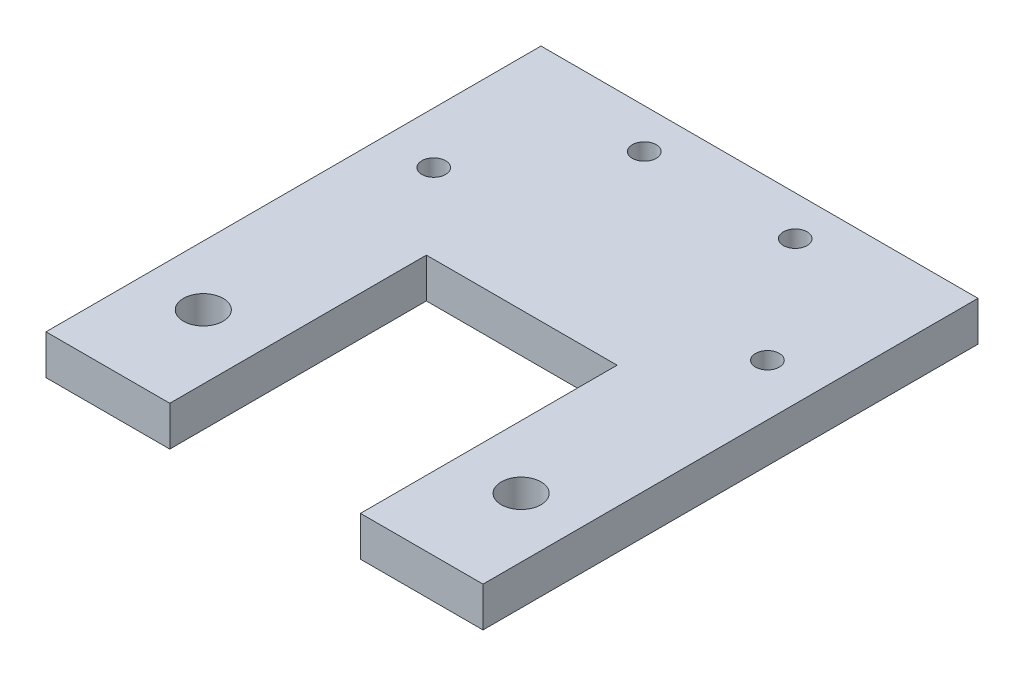
ISO-10303-21;
HEADER;
FILE_DESCRIPTION(('STEP AP214'),'2;1');
FILE_NAME('part.step','',(''),(''),'','','');
FILE_SCHEMA(('AUTOMOTIVE_DESIGN { 1 0 10303 214 1 1 1 1 }'));
ENDSEC;
DATA;
#1=APPLICATION_CONTEXT('core data for automotive mechanical design processes');
#2=APPLICATION_PROTOCOL_DEFINITION('international standard','automotive_design',2000,#1);
#3=PRODUCT_CONTEXT('',#1,'mechanical');
#4=PRODUCT('Part','Part','',(#3));
#5=PRODUCT_RELATED_PRODUCT_CATEGORY('part','',(#4));
#6=PRODUCT_DEFINITION_FORMATION('','',#4);
#7=PRODUCT_DEFINITION_CONTEXT('part definition',#1,'design');
#8=PRODUCT_DEFINITION('design','',#6,#7);
#9=PRODUCT_DEFINITION_SHAPE('','',#8);
#10=(LENGTH_UNIT() NAMED_UNIT(*) SI_UNIT(.MILLI.,.METRE.));
#11=(NAMED_UNIT(*) PLANE_ANGLE_UNIT() SI_UNIT($,.RADIAN.));
#12=(NAMED_UNIT(*) SI_UNIT($,.STERADIAN.) SOLID_ANGLE_UNIT());
#13=UNCERTAINTY_MEASURE_WITH_UNIT(LENGTH_MEASURE(1.E-05),#10,'distance_accuracy_value','');
#14=(GEOMETRIC_REPRESENTATION_CONTEXT(3) GLOBAL_UNCERTAINTY_ASSIGNED_CONTEXT((#13)) GLOBAL_UNIT_ASSIGNED_CONTEXT((#10,
#11,#12)) REPRESENTATION_CONTEXT('',''));
#15=CARTESIAN_POINT('',(0.,0.,0.));
#16=DIRECTION('',(0.,0.,1.));
#17=DIRECTION('',(1.,0.,0.));
#18=AXIS2_PLACEMENT_3D('',#15,#16,#17);
#19=CARTESIAN_POINT('',(-32.5,5.,-50.));
#20=DIRECTION('',(0.,0.,1.));
#21=DIRECTION('',(1.,0.,0.));
#22=AXIS2_PLACEMENT_3D('',#19,#20,#21);
#23=PLANE('',#22);
#24=DIRECTION('',(-1.,0.,0.));
#25=VECTOR('',#24,1.);
#26=CARTESIAN_POINT('',(-32.5,5.,-50.));
#27=LINE('',#26,#25);
#28=CARTESIAN_POINT('',(27.5,5.,-50.));
#29=VERTEX_POINT('',#28);
#30=CARTESIAN_POINT('',(-27.5,5.,-50.));
#31=VERTEX_POINT('',#30);
#32=EDGE_CURVE('E11',#29,#31,#27,.T.);
#33=ORIENTED_EDGE('',*,*,#32,.F.);
#34=DIRECTION('',(0.,1.,0.));
#35=VECTOR('',#34,1.);
#36=CARTESIAN_POINT('',(27.5,0.,-50.));
#37=LINE('',#36,#35);
#38=CARTESIAN_POINT('',(27.5,0.,-50.));
#39=VERTEX_POINT('',#38);
#40=EDGE_CURVE('E98',#39,#29,#37,.T.);
#41=ORIENTED_EDGE('',*,*,#40,.F.);
#42=DIRECTION('',(-1.,0.,0.));
#43=VECTOR('',#42,1.);
#44=CARTESIAN_POINT('',(-32.5,0.,-50.));
#45=LINE('',#44,#43);
#46=CARTESIAN_POINT('',(-27.5,0.,-50.));
#47=VERTEX_POINT('',#46);
#48=EDGE_CURVE('E36',#39,#47,#45,.T.);
#49=ORIENTED_EDGE('',*,*,#48,.T.);
#50=DIRECTION('',(0.,1.,0.));
#51=VECTOR('',#50,1.);
#52=CARTESIAN_POINT('',(-27.5,0.,-50.));
#53=LINE('',#52,#51);
#54=EDGE_CURVE('E185',#47,#31,#53,.T.);
#55=ORIENTED_EDGE('',*,*,#54,.T.);
#56=EDGE_LOOP('',(#33,#41,#49,#55));
#57=FACE_BOUND('',#56,.T.);
#58=ADVANCED_FACE('F33',(#57),#23,.F.);
#59=CARTESIAN_POINT('',(0.,5.,0.));
#60=DIRECTION('',(0.,1.,0.));
#61=DIRECTION('',(0.,0.,1.));
#62=AXIS2_PLACEMENT_3D('',#59,#60,#61);
#63=PLANE('',#62);
#64=DIRECTION('',(0.,0.,1.));
#65=VECTOR('',#64,1.);
#66=CARTESIAN_POINT('',(27.5,5.,-50.));
#67=LINE('',#66,#65);
#68=CARTESIAN_POINT('',(27.5,5.,12.296044523428));
#69=VERTEX_POINT('',#68);
#70=EDGE_CURVE('E47',#29,#69,#67,.T.);
#71=ORIENTED_EDGE('',*,*,#70,.F.);
#72=ORIENTED_EDGE('',*,*,#32,.T.);
#73=DIRECTION('',(0.,0.,1.));
#74=VECTOR('',#73,1.);
#75=CARTESIAN_POINT('',(-27.5,5.,0.));
#76=LINE('',#75,#74);
#77=CARTESIAN_POINT('',(-27.5,5.,12.296044523428));
#78=VERTEX_POINT('',#77);
#79=EDGE_CURVE('E188',#31,#78,#76,.T.);
#80=ORIENTED_EDGE('',*,*,#79,.T.);
#81=DIRECTION('',(-1.,0.,0.));
#82=VECTOR('',#81,1.);
#83=CARTESIAN_POINT('',(-32.5,5.,12.296044523428));
#84=LINE('',#83,#82);
#85=CARTESIAN_POINT('',(-11.9235396755643,5.,12.296044523428));
#86=VERTEX_POINT('',#85);
#87=EDGE_CURVE('E173',#86,#78,#84,.T.);
#88=ORIENTED_EDGE('',*,*,#87,.F.);
#89=DIRECTION('',(0.,0.,1.));
#90=VECTOR('',#89,1.);
#91=CARTESIAN_POINT('',(-11.9235396755643,5.,-20.));
#92=LINE('',#91,#90);
#93=CARTESIAN_POINT('',(-11.9235396755643,5.,-20.));
#94=VERTEX_POINT('',#93);
#95=EDGE_CURVE('E155',#94,#86,#92,.T.);
#96=ORIENTED_EDGE('',*,*,#95,.F.);
#97=DIRECTION('',(-1.,0.,0.));
#98=VECTOR('',#97,1.);
#99=CARTESIAN_POINT('',(-11.9235396755643,5.,-20.));
#100=LINE('',#99,#98);
#101=CARTESIAN_POINT('',(12.0764603244357,5.,-20.));
#102=VERTEX_POINT('',#101);
#103=EDGE_CURVE('E159',#102,#94,#100,.T.);
#104=ORIENTED_EDGE('',*,*,#103,.F.);
#105=DIRECTION('',(0.,0.,-1.));
#106=VECTOR('',#105,1.);
#107=CARTESIAN_POINT('',(12.0764603244357,5.,-20.));
#108=LINE('',#107,#106);
#109=CARTESIAN_POINT('',(12.0764603244357,5.,12.296044523428));
#110=VERTEX_POINT('',#109);
#111=EDGE_CURVE('E162',#110,#102,#108,.T.);
#112=ORIENTED_EDGE('',*,*,#111,.F.);
#113=DIRECTION('',(-1.,0.,0.));
#114=VECTOR('',#113,1.);
#115=CARTESIAN_POINT('',(12.0764603244357,5.,12.296044523428));
#116=LINE('',#115,#114);
#117=EDGE_CURVE('E181',#69,#110,#116,.T.);
#118=ORIENTED_EDGE('',*,*,#117,.F.);
#119=EDGE_LOOP('',(#71,#72,#80,#88,#96,#104,#112,#118));
#120=FACE_BOUND('',#119,.T.);
#121=CARTESIAN_POINT('',(-20.,5.,0.));
#122=DIRECTION('',(0.,1.,0.));
#123=DIRECTION('',(0.,0.,1.));
#124=AXIS2_PLACEMENT_3D('',#121,#122,#123);
#125=CIRCLE('',#124,2.5);
#126=CARTESIAN_POINT('',(-20.,5.,2.5));
#127=VERTEX_POINT('',#126);
#128=EDGE_CURVE('E132',#127,#127,#125,.T.);
#129=ORIENTED_EDGE('',*,*,#128,.F.);
#130=EDGE_LOOP('',(#129));
#131=FACE_BOUND('',#130,.T.);
#132=CARTESIAN_POINT('',(9.5,5.,-45.));
#133=DIRECTION('',(0.,1.,0.));
#134=DIRECTION('',(0.,0.,1.));
#135=AXIS2_PLACEMENT_3D('',#132,#133,#134);
#136=CIRCLE('',#135,1.5);
#137=CARTESIAN_POINT('',(9.5,5.,-43.5));
#138=VERTEX_POINT('',#137);
#139=EDGE_CURVE('E139',#138,#138,#136,.T.);
#140=ORIENTED_EDGE('',*,*,#139,.F.);
#141=EDGE_LOOP('',(#140));
#142=FACE_BOUND('',#141,.T.);
#143=CARTESIAN_POINT('',(-9.5,5.,-45.));
#144=DIRECTION('',(0.,1.,0.));
#145=DIRECTION('',(0.,0.,1.));
#146=AXIS2_PLACEMENT_3D('',#143,#144,#145);
#147=CIRCLE('',#146,1.5);
#148=CARTESIAN_POINT('',(-9.5,5.,-43.5));
#149=VERTEX_POINT('',#148);
#150=EDGE_CURVE('E120',#149,#149,#147,.T.);
#151=ORIENTED_EDGE('',*,*,#150,.F.);
#152=EDGE_LOOP('',(#151));
#153=FACE_BOUND('',#152,.T.);
#154=CARTESIAN_POINT('',(21.,5.,-30.));
#155=DIRECTION('',(0.,1.,0.));
#156=DIRECTION('',(0.,0.,1.));
#157=AXIS2_PLACEMENT_3D('',#154,#155,#156);
#158=CIRCLE('',#157,1.5);
#159=CARTESIAN_POINT('',(21.,5.,-28.5));
#160=VERTEX_POINT('',#159);
#161=EDGE_CURVE('E127',#160,#160,#158,.T.);
#162=ORIENTED_EDGE('',*,*,#161,.F.);
#163=EDGE_LOOP('',(#162));
#164=FACE_BOUND('',#163,.T.);
#165=CARTESIAN_POINT('',(20.,5.,0.));
#166=DIRECTION('',(0.,1.,0.));
#167=DIRECTION('',(0.,0.,1.));
#168=AXIS2_PLACEMENT_3D('',#165,#166,#167);
#169=CIRCLE('',#168,2.5);
#170=CARTESIAN_POINT('',(20.,5.,2.5));
#171=VERTEX_POINT('',#170);
#172=EDGE_CURVE('E144',#171,#171,#169,.T.);
#173=ORIENTED_EDGE('',*,*,#172,.F.);
#174=EDGE_LOOP('',(#173));
#175=FACE_BOUND('',#174,.T.);
#176=CARTESIAN_POINT('',(-21.,5.,-30.));
#177=DIRECTION('',(0.,1.,0.));
#178=DIRECTION('',(0.,0.,1.));
#179=AXIS2_PLACEMENT_3D('',#176,#177,#178);
#180=CIRCLE('',#179,1.5);
#181=CARTESIAN_POINT('',(-21.,5.,-28.5));
#182=VERTEX_POINT('',#181);
#183=EDGE_CURVE('E112',#182,#182,#180,.T.);
#184=ORIENTED_EDGE('',*,*,#183,.F.);
#185=EDGE_LOOP('',(#184));
#186=FACE_BOUND('',#185,.T.);
#187=ADVANCED_FACE('F199',(#120,#131,#142,#153,#164,#175,#186),#63,.T.);
#188=CARTESIAN_POINT('',(0.,0.,0.));
#189=DIRECTION('',(0.,1.,0.));
#190=DIRECTION('',(0.,0.,1.));
#191=AXIS2_PLACEMENT_3D('',#188,#189,#190);
#192=PLANE('',#191);
#193=CARTESIAN_POINT('',(-21.,0.,-30.));
#194=DIRECTION('',(0.,1.,0.));
#195=DIRECTION('',(0.,0.,1.));
#196=AXIS2_PLACEMENT_3D('',#193,#194,#195);
#197=CIRCLE('',#196,1.5);
#198=CARTESIAN_POINT('',(-21.,0.,-28.5));
#199=VERTEX_POINT('',#198);
#200=EDGE_CURVE('E110',#199,#199,#197,.T.);
#201=ORIENTED_EDGE('',*,*,#200,.T.);
#202=EDGE_LOOP('',(#201));
#203=FACE_BOUND('',#202,.T.);
#204=CARTESIAN_POINT('',(20.,0.,0.));
#205=DIRECTION('',(0.,1.,0.));
#206=DIRECTION('',(0.,0.,1.));
#207=AXIS2_PLACEMENT_3D('',#204,#205,#206);
#208=CIRCLE('',#207,2.5);
#209=CARTESIAN_POINT('',(20.,0.,2.5));
#210=VERTEX_POINT('',#209);
#211=EDGE_CURVE('E136',#210,#210,#208,.T.);
#212=ORIENTED_EDGE('',*,*,#211,.T.);
#213=EDGE_LOOP('',(#212));
#214=FACE_BOUND('',#213,.T.);
#215=CARTESIAN_POINT('',(21.,0.,-30.));
#216=DIRECTION('',(0.,1.,0.));
#217=DIRECTION('',(0.,0.,1.));
#218=AXIS2_PLACEMENT_3D('',#215,#216,#217);
#219=CIRCLE('',#218,1.5);
#220=CARTESIAN_POINT('',(21.,0.,-28.5));
#221=VERTEX_POINT('',#220);
#222=EDGE_CURVE('E117',#221,#221,#219,.T.);
#223=ORIENTED_EDGE('',*,*,#222,.T.);
#224=EDGE_LOOP('',(#223));
#225=FACE_BOUND('',#224,.T.);
#226=CARTESIAN_POINT('',(-9.5,0.,-45.));
#227=DIRECTION('',(0.,1.,0.));
#228=DIRECTION('',(0.,0.,1.));
#229=AXIS2_PLACEMENT_3D('',#226,#227,#228);
#230=CIRCLE('',#229,1.5);
#231=CARTESIAN_POINT('',(-9.5,0.,-43.5));
#232=VERTEX_POINT('',#231);
#233=EDGE_CURVE('E123',#232,#232,#230,.T.);
#234=ORIENTED_EDGE('',*,*,#233,.T.);
#235=EDGE_LOOP('',(#234));
#236=FACE_BOUND('',#235,.T.);
#237=CARTESIAN_POINT('',(9.5,0.,-45.));
#238=DIRECTION('',(0.,1.,0.));
#239=DIRECTION('',(0.,0.,1.));
#240=AXIS2_PLACEMENT_3D('',#237,#238,#239);
#241=CIRCLE('',#240,1.5);
#242=CARTESIAN_POINT('',(9.5,0.,-43.5));
#243=VERTEX_POINT('',#242);
#244=EDGE_CURVE('E124',#243,#243,#241,.T.);
#245=ORIENTED_EDGE('',*,*,#244,.T.);
#246=EDGE_LOOP('',(#245));
#247=FACE_BOUND('',#246,.T.);
#248=CARTESIAN_POINT('',(-20.,0.,0.));
#249=DIRECTION('',(0.,1.,0.));
#250=DIRECTION('',(0.,0.,1.));
#251=AXIS2_PLACEMENT_3D('',#248,#249,#250);
#252=CIRCLE('',#251,2.5);
#253=CARTESIAN_POINT('',(-20.,0.,2.5));
#254=VERTEX_POINT('',#253);
#255=EDGE_CURVE('E135',#254,#254,#252,.T.);
#256=ORIENTED_EDGE('',*,*,#255,.T.);
#257=EDGE_LOOP('',(#256));
#258=FACE_BOUND('',#257,.T.);
#259=ORIENTED_EDGE('',*,*,#48,.F.);
#260=DIRECTION('',(0.,0.,1.));
#261=VECTOR('',#260,1.);
#262=CARTESIAN_POINT('',(27.5,0.,-50.));
#263=LINE('',#262,#261);
#264=CARTESIAN_POINT('',(27.5,0.,12.296044523428));
#265=VERTEX_POINT('',#264);
#266=EDGE_CURVE('E95',#39,#265,#263,.T.);
#267=ORIENTED_EDGE('',*,*,#266,.T.);
#268=DIRECTION('',(-1.,0.,0.));
#269=VECTOR('',#268,1.);
#270=CARTESIAN_POINT('',(12.0764603244357,0.,12.296044523428));
#271=LINE('',#270,#269);
#272=CARTESIAN_POINT('',(12.0764603244357,0.,12.296044523428));
#273=VERTEX_POINT('',#272);
#274=EDGE_CURVE('E180',#265,#273,#271,.T.);
#275=ORIENTED_EDGE('',*,*,#274,.T.);
#276=DIRECTION('',(0.,0.,-1.));
#277=VECTOR('',#276,1.);
#278=CARTESIAN_POINT('',(12.0764603244357,0.,-20.));
#279=LINE('',#278,#277);
#280=CARTESIAN_POINT('',(12.0764603244357,0.,-20.));
#281=VERTEX_POINT('',#280);
#282=EDGE_CURVE('E158',#273,#281,#279,.T.);
#283=ORIENTED_EDGE('',*,*,#282,.T.);
#284=DIRECTION('',(-1.,0.,0.));
#285=VECTOR('',#284,1.);
#286=CARTESIAN_POINT('',(-11.9235396755643,0.,-20.));
#287=LINE('',#286,#285);
#288=CARTESIAN_POINT('',(-11.9235396755643,0.,-20.));
#289=VERTEX_POINT('',#288);
#290=EDGE_CURVE('E167',#281,#289,#287,.T.);
#291=ORIENTED_EDGE('',*,*,#290,.T.);
#292=DIRECTION('',(0.,0.,1.));
#293=VECTOR('',#292,1.);
#294=CARTESIAN_POINT('',(-11.9235396755643,0.,-20.));
#295=LINE('',#294,#293);
#296=CARTESIAN_POINT('',(-11.9235396755643,0.,12.296044523428));
#297=VERTEX_POINT('',#296);
#298=EDGE_CURVE('E153',#289,#297,#295,.T.);
#299=ORIENTED_EDGE('',*,*,#298,.T.);
#300=DIRECTION('',(-1.,0.,0.));
#301=VECTOR('',#300,1.);
#302=CARTESIAN_POINT('',(-32.5,0.,12.296044523428));
#303=LINE('',#302,#301);
#304=CARTESIAN_POINT('',(-27.5,0.,12.296044523428));
#305=VERTEX_POINT('',#304);
#306=EDGE_CURVE('E172',#297,#305,#303,.T.);
#307=ORIENTED_EDGE('',*,*,#306,.T.);
#308=DIRECTION('',(0.,0.,1.));
#309=VECTOR('',#308,1.);
#310=CARTESIAN_POINT('',(-27.5,0.,0.));
#311=LINE('',#310,#309);
#312=EDGE_CURVE('E55',#47,#305,#311,.T.);
#313=ORIENTED_EDGE('',*,*,#312,.F.);
#314=EDGE_LOOP('',(#259,#267,#275,#283,#291,#299,#307,#313));
#315=FACE_BOUND('',#314,.T.);
#316=ADVANCED_FACE('F108',(#203,#214,#225,#236,#247,#258,#315),#192,.F.);
#317=CARTESIAN_POINT('',(-32.5,0.,12.296044523428));
#318=DIRECTION('',(0.,0.,-1.));
#319=DIRECTION('',(-1.,0.,0.));
#320=AXIS2_PLACEMENT_3D('',#317,#318,#319);
#321=PLANE('',#320);
#322=DIRECTION('',(0.,1.,0.));
#323=VECTOR('',#322,1.);
#324=CARTESIAN_POINT('',(-27.5,0.,12.296044523428));
#325=LINE('',#324,#323);
#326=EDGE_CURVE('E183',#305,#78,#325,.T.);
#327=ORIENTED_EDGE('',*,*,#326,.F.);
#328=ORIENTED_EDGE('',*,*,#306,.F.);
#329=DIRECTION('',(0.,1.,0.));
#330=VECTOR('',#329,1.);
#331=CARTESIAN_POINT('',(-11.9235396755643,0.,12.296044523428));
#332=LINE('',#331,#330);
#333=EDGE_CURVE('E164',#297,#86,#332,.T.);
#334=ORIENTED_EDGE('',*,*,#333,.T.);
#335=ORIENTED_EDGE('',*,*,#87,.T.);
#336=EDGE_LOOP('',(#327,#328,#334,#335));
#337=FACE_BOUND('',#336,.T.);
#338=ADVANCED_FACE('F216',(#337),#321,.F.);
#339=CARTESIAN_POINT('',(-21.,0.,-30.));
#340=DIRECTION('',(0.,1.,0.));
#341=DIRECTION('',(0.,0.,1.));
#342=AXIS2_PLACEMENT_3D('',#339,#340,#341);
#343=CYLINDRICAL_SURFACE('',#342,1.5);
#344=ORIENTED_EDGE('',*,*,#200,.F.);
#345=EDGE_LOOP('',(#344));
#346=FACE_BOUND('',#345,.T.);
#347=ORIENTED_EDGE('',*,*,#183,.T.);
#348=EDGE_LOOP('',(#347));
#349=FACE_BOUND('',#348,.T.);
#350=ADVANCED_FACE('F236',(#346,#349),#343,.F.);
#351=CARTESIAN_POINT('',(20.,0.,0.));
#352=DIRECTION('',(0.,1.,0.));
#353=DIRECTION('',(0.,0.,1.));
#354=AXIS2_PLACEMENT_3D('',#351,#352,#353);
#355=CYLINDRICAL_SURFACE('',#354,2.5);
#356=ORIENTED_EDGE('',*,*,#211,.F.);
#357=EDGE_LOOP('',(#356));
#358=FACE_BOUND('',#357,.T.);
#359=ORIENTED_EDGE('',*,*,#172,.T.);
#360=EDGE_LOOP('',(#359));
#361=FACE_BOUND('',#360,.T.);
#362=ADVANCED_FACE('F239',(#358,#361),#355,.F.);
#363=CARTESIAN_POINT('',(21.,0.,-30.));
#364=DIRECTION('',(0.,1.,0.));
#365=DIRECTION('',(0.,0.,1.));
#366=AXIS2_PLACEMENT_3D('',#363,#364,#365);
#367=CYLINDRICAL_SURFACE('',#366,1.5);
#368=ORIENTED_EDGE('',*,*,#222,.F.);
#369=EDGE_LOOP('',(#368));
#370=FACE_BOUND('',#369,.T.);
#371=ORIENTED_EDGE('',*,*,#161,.T.);
#372=EDGE_LOOP('',(#371));
#373=FACE_BOUND('',#372,.T.);
#374=ADVANCED_FACE('F245',(#370,#373),#367,.F.);
#375=CARTESIAN_POINT('',(-9.5,0.,-45.));
#376=DIRECTION('',(0.,1.,0.));
#377=DIRECTION('',(0.,0.,1.));
#378=AXIS2_PLACEMENT_3D('',#375,#376,#377);
#379=CYLINDRICAL_SURFACE('',#378,1.5);
#380=ORIENTED_EDGE('',*,*,#233,.F.);
#381=EDGE_LOOP('',(#380));
#382=FACE_BOUND('',#381,.T.);
#383=ORIENTED_EDGE('',*,*,#150,.T.);
#384=EDGE_LOOP('',(#383));
#385=FACE_BOUND('',#384,.T.);
#386=ADVANCED_FACE('F241',(#382,#385),#379,.F.);
#387=CARTESIAN_POINT('',(9.5,0.,-45.));
#388=DIRECTION('',(0.,1.,0.));
#389=DIRECTION('',(0.,0.,1.));
#390=AXIS2_PLACEMENT_3D('',#387,#388,#389);
#391=CYLINDRICAL_SURFACE('',#390,1.5);
#392=ORIENTED_EDGE('',*,*,#244,.F.);
#393=EDGE_LOOP('',(#392));
#394=FACE_BOUND('',#393,.T.);
#395=ORIENTED_EDGE('',*,*,#139,.T.);
#396=EDGE_LOOP('',(#395));
#397=FACE_BOUND('',#396,.T.);
#398=ADVANCED_FACE('F244',(#394,#397),#391,.F.);
#399=CARTESIAN_POINT('',(-20.,0.,0.));
#400=DIRECTION('',(0.,1.,0.));
#401=DIRECTION('',(0.,0.,1.));
#402=AXIS2_PLACEMENT_3D('',#399,#400,#401);
#403=CYLINDRICAL_SURFACE('',#402,2.5);
#404=ORIENTED_EDGE('',*,*,#255,.F.);
#405=EDGE_LOOP('',(#404));
#406=FACE_BOUND('',#405,.T.);
#407=ORIENTED_EDGE('',*,*,#128,.T.);
#408=EDGE_LOOP('',(#407));
#409=FACE_BOUND('',#408,.T.);
#410=ADVANCED_FACE('F250',(#406,#409),#403,.F.);
#411=CARTESIAN_POINT('',(12.0764603244357,0.,-20.));
#412=DIRECTION('',(1.,0.,0.));
#413=DIRECTION('',(0.,0.,-1.));
#414=AXIS2_PLACEMENT_3D('',#411,#412,#413);
#415=PLANE('',#414);
#416=ORIENTED_EDGE('',*,*,#282,.F.);
#417=DIRECTION('',(0.,1.,0.));
#418=VECTOR('',#417,1.);
#419=CARTESIAN_POINT('',(12.0764603244357,0.,12.296044523428));
#420=LINE('',#419,#418);
#421=EDGE_CURVE('E176',#273,#110,#420,.T.);
#422=ORIENTED_EDGE('',*,*,#421,.T.);
#423=ORIENTED_EDGE('',*,*,#111,.T.);
#424=DIRECTION('',(0.,1.,0.));
#425=VECTOR('',#424,1.);
#426=CARTESIAN_POINT('',(12.0764603244357,0.,-20.));
#427=LINE('',#426,#425);
#428=EDGE_CURVE('E150',#281,#102,#427,.T.);
#429=ORIENTED_EDGE('',*,*,#428,.F.);
#430=EDGE_LOOP('',(#416,#422,#423,#429));
#431=FACE_BOUND('',#430,.T.);
#432=ADVANCED_FACE('F206',(#431),#415,.F.);
#433=CARTESIAN_POINT('',(-11.9235396755643,0.,-20.));
#434=DIRECTION('',(-1.,0.,0.));
#435=DIRECTION('',(0.,0.,1.));
#436=AXIS2_PLACEMENT_3D('',#433,#434,#435);
#437=PLANE('',#436);
#438=ORIENTED_EDGE('',*,*,#95,.T.);
#439=ORIENTED_EDGE('',*,*,#333,.F.);
#440=ORIENTED_EDGE('',*,*,#298,.F.);
#441=DIRECTION('',(0.,1.,0.));
#442=VECTOR('',#441,1.);
#443=CARTESIAN_POINT('',(-11.9235396755643,0.,-20.));
#444=LINE('',#443,#442);
#445=EDGE_CURVE('E147',#289,#94,#444,.T.);
#446=ORIENTED_EDGE('',*,*,#445,.T.);
#447=EDGE_LOOP('',(#438,#439,#440,#446));
#448=FACE_BOUND('',#447,.T.);
#449=ADVANCED_FACE('F213',(#448),#437,.F.);
#450=CARTESIAN_POINT('',(-11.9235396755643,0.,-20.));
#451=DIRECTION('',(0.,0.,-1.));
#452=DIRECTION('',(-1.,0.,0.));
#453=AXIS2_PLACEMENT_3D('',#450,#451,#452);
#454=PLANE('',#453);
#455=ORIENTED_EDGE('',*,*,#103,.T.);
#456=ORIENTED_EDGE('',*,*,#445,.F.);
#457=ORIENTED_EDGE('',*,*,#290,.F.);
#458=ORIENTED_EDGE('',*,*,#428,.T.);
#459=EDGE_LOOP('',(#455,#456,#457,#458));
#460=FACE_BOUND('',#459,.T.);
#461=ADVANCED_FACE('F209',(#460),#454,.F.);
#462=CARTESIAN_POINT('',(12.0764603244357,0.,12.296044523428));
#463=DIRECTION('',(0.,0.,-1.));
#464=DIRECTION('',(-1.,0.,0.));
#465=AXIS2_PLACEMENT_3D('',#462,#463,#464);
#466=PLANE('',#465);
#467=ORIENTED_EDGE('',*,*,#274,.F.);
#468=DIRECTION('',(0.,1.,0.));
#469=VECTOR('',#468,1.);
#470=CARTESIAN_POINT('',(27.5,0.,12.296044523428));
#471=LINE('',#470,#469);
#472=EDGE_CURVE('E99',#265,#69,#471,.T.);
#473=ORIENTED_EDGE('',*,*,#472,.T.);
#474=ORIENTED_EDGE('',*,*,#117,.T.);
#475=ORIENTED_EDGE('',*,*,#421,.F.);
#476=EDGE_LOOP('',(#467,#473,#474,#475));
#477=FACE_BOUND('',#476,.T.);
#478=ADVANCED_FACE('F195',(#477),#466,.F.);
#479=CARTESIAN_POINT('',(-27.5,0.,0.));
#480=DIRECTION('',(-1.,0.,0.));
#481=DIRECTION('',(0.,0.,1.));
#482=AXIS2_PLACEMENT_3D('',#479,#480,#481);
#483=PLANE('',#482);
#484=ORIENTED_EDGE('',*,*,#79,.F.);
#485=ORIENTED_EDGE('',*,*,#54,.F.);
#486=ORIENTED_EDGE('',*,*,#312,.T.);
#487=ORIENTED_EDGE('',*,*,#326,.T.);
#488=EDGE_LOOP('',(#484,#485,#486,#487));
#489=FACE_BOUND('',#488,.T.);
#490=ADVANCED_FACE('F218',(#489),#483,.T.);
#491=CARTESIAN_POINT('',(27.5,0.,-50.));
#492=DIRECTION('',(-1.,0.,0.));
#493=DIRECTION('',(0.,0.,1.));
#494=AXIS2_PLACEMENT_3D('',#491,#492,#493);
#495=PLANE('',#494);
#496=ORIENTED_EDGE('',*,*,#70,.T.);
#497=ORIENTED_EDGE('',*,*,#472,.F.);
#498=ORIENTED_EDGE('',*,*,#266,.F.);
#499=ORIENTED_EDGE('',*,*,#40,.T.);
#500=EDGE_LOOP('',(#496,#497,#498,#499));
#501=FACE_BOUND('',#500,.T.);
#502=ADVANCED_FACE('F97',(#501),#495,.F.);
#503=CLOSED_SHELL('',(#58,#187,#316,#338,#350,#362,#374,#386,#398,#410,#432,#449,#461,#478,#490,#502));
#504=MANIFOLD_SOLID_BREP('B2',#503);
#505=ADVANCED_BREP_SHAPE_REPRESENTATION('',(#18,#504),#14);
#506=SHAPE_DEFINITION_REPRESENTATION(#9,#505);
ENDSEC;
END-ISO-10303-21;
